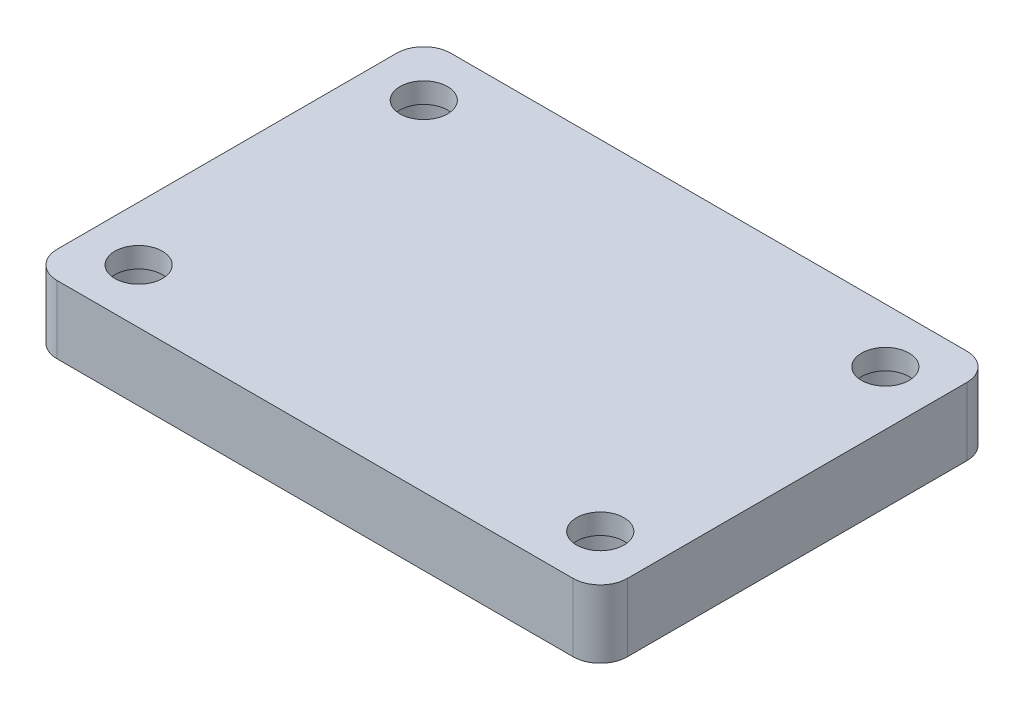
ISO-10303-21;
HEADER;
FILE_DESCRIPTION(('STEP AP214'),'2;1');
FILE_NAME('part.step','',(''),(''),'','','');
FILE_SCHEMA(('AUTOMOTIVE_DESIGN { 1 0 10303 214 1 1 1 1 }'));
ENDSEC;
DATA;
#1=APPLICATION_CONTEXT('core data for automotive mechanical design processes');
#2=APPLICATION_PROTOCOL_DEFINITION('international standard','automotive_design',2000,#1);
#3=PRODUCT_CONTEXT('',#1,'mechanical');
#4=PRODUCT('Part','Part','',(#3));
#5=PRODUCT_RELATED_PRODUCT_CATEGORY('part','',(#4));
#6=PRODUCT_DEFINITION_FORMATION('','',#4);
#7=PRODUCT_DEFINITION_CONTEXT('part definition',#1,'design');
#8=PRODUCT_DEFINITION('design','',#6,#7);
#9=PRODUCT_DEFINITION_SHAPE('','',#8);
#10=(LENGTH_UNIT() NAMED_UNIT(*) SI_UNIT(.MILLI.,.METRE.));
#11=(NAMED_UNIT(*) PLANE_ANGLE_UNIT() SI_UNIT($,.RADIAN.));
#12=(NAMED_UNIT(*) SI_UNIT($,.STERADIAN.) SOLID_ANGLE_UNIT());
#13=UNCERTAINTY_MEASURE_WITH_UNIT(LENGTH_MEASURE(1.E-05),#10,'distance_accuracy_value','');
#14=(GEOMETRIC_REPRESENTATION_CONTEXT(3) GLOBAL_UNCERTAINTY_ASSIGNED_CONTEXT((#13)) GLOBAL_UNIT_ASSIGNED_CONTEXT((#10,
#11,#12)) REPRESENTATION_CONTEXT('',''));
#15=CARTESIAN_POINT('',(0.,0.,0.));
#16=DIRECTION('',(0.,0.,1.));
#17=DIRECTION('',(1.,0.,0.));
#18=AXIS2_PLACEMENT_3D('',#15,#16,#17);
#19=CARTESIAN_POINT('',(0.,10.,0.));
#20=DIRECTION('',(1.,0.,0.));
#21=DIRECTION('',(0.,0.,-1.));
#22=AXIS2_PLACEMENT_3D('',#19,#20,#21);
#23=PLANE('',#22);
#24=DIRECTION('',(0.,0.,1.));
#25=VECTOR('',#24,1.);
#26=CARTESIAN_POINT('',(0.,0.,0.));
#27=LINE('',#26,#25);
#28=CARTESIAN_POINT('',(0.,0.,-54.));
#29=VERTEX_POINT('',#28);
#30=CARTESIAN_POINT('',(0.,0.,-4.));
#31=VERTEX_POINT('',#30);
#32=EDGE_CURVE('E130',#29,#31,#27,.T.);
#33=ORIENTED_EDGE('',*,*,#32,.T.);
#34=DIRECTION('',(0.,-1.,0.));
#35=VECTOR('',#34,1.);
#36=CARTESIAN_POINT('',(0.,10.,-4.));
#37=LINE('',#36,#35);
#38=CARTESIAN_POINT('',(0.,10.,-4.));
#39=VERTEX_POINT('',#38);
#40=EDGE_CURVE('E177',#31,#39,#37,.F.);
#41=ORIENTED_EDGE('',*,*,#40,.T.);
#42=DIRECTION('',(0.,0.,1.));
#43=VECTOR('',#42,1.);
#44=CARTESIAN_POINT('',(0.,10.,0.));
#45=LINE('',#44,#43);
#46=CARTESIAN_POINT('',(0.,10.,-54.));
#47=VERTEX_POINT('',#46);
#48=EDGE_CURVE('E128',#47,#39,#45,.T.);
#49=ORIENTED_EDGE('',*,*,#48,.F.);
#50=DIRECTION('',(0.,-1.,0.));
#51=VECTOR('',#50,1.);
#52=CARTESIAN_POINT('',(0.,10.,-54.));
#53=LINE('',#52,#51);
#54=EDGE_CURVE('E174',#47,#29,#53,.T.);
#55=ORIENTED_EDGE('',*,*,#54,.T.);
#56=EDGE_LOOP('',(#33,#41,#49,#55));
#57=FACE_BOUND('',#56,.T.);
#58=ADVANCED_FACE('F34',(#57),#23,.F.);
#59=CARTESIAN_POINT('',(0.,10.,0.));
#60=DIRECTION('',(0.,0.,-1.));
#61=DIRECTION('',(-1.,0.,0.));
#62=AXIS2_PLACEMENT_3D('',#59,#60,#61);
#63=PLANE('',#62);
#64=DIRECTION('',(1.,0.,0.));
#65=VECTOR('',#64,1.);
#66=CARTESIAN_POINT('',(0.,0.,0.));
#67=LINE('',#66,#65);
#68=CARTESIAN_POINT('',(4.,0.,0.));
#69=VERTEX_POINT('',#68);
#70=CARTESIAN_POINT('',(80.,0.,0.));
#71=VERTEX_POINT('',#70);
#72=EDGE_CURVE('E126',#69,#71,#67,.T.);
#73=ORIENTED_EDGE('',*,*,#72,.T.);
#74=DIRECTION('',(0.,-1.,0.));
#75=VECTOR('',#74,1.);
#76=CARTESIAN_POINT('',(80.,10.,0.));
#77=LINE('',#76,#75);
#78=CARTESIAN_POINT('',(80.,10.,0.));
#79=VERTEX_POINT('',#78);
#80=EDGE_CURVE('E104',#71,#79,#77,.F.);
#81=ORIENTED_EDGE('',*,*,#80,.T.);
#82=DIRECTION('',(1.,0.,0.));
#83=VECTOR('',#82,1.);
#84=CARTESIAN_POINT('',(0.,10.,0.));
#85=LINE('',#84,#83);
#86=CARTESIAN_POINT('',(4.,10.,0.));
#87=VERTEX_POINT('',#86);
#88=EDGE_CURVE('E193',#87,#79,#85,.T.);
#89=ORIENTED_EDGE('',*,*,#88,.F.);
#90=DIRECTION('',(0.,-1.,0.));
#91=VECTOR('',#90,1.);
#92=CARTESIAN_POINT('',(4.,10.,0.));
#93=LINE('',#92,#91);
#94=EDGE_CURVE('E109',#87,#69,#93,.T.);
#95=ORIENTED_EDGE('',*,*,#94,.T.);
#96=EDGE_LOOP('',(#73,#81,#89,#95));
#97=FACE_BOUND('',#96,.T.);
#98=ADVANCED_FACE('F255',(#97),#63,.F.);
#99=CARTESIAN_POINT('',(84.,10.,0.));
#100=DIRECTION('',(-1.,0.,0.));
#101=DIRECTION('',(0.,0.,1.));
#102=AXIS2_PLACEMENT_3D('',#99,#100,#101);
#103=PLANE('',#102);
#104=DIRECTION('',(0.,0.,-1.));
#105=VECTOR('',#104,1.);
#106=CARTESIAN_POINT('',(84.,10.,0.));
#107=LINE('',#106,#105);
#108=CARTESIAN_POINT('',(84.,10.,-4.));
#109=VERTEX_POINT('',#108);
#110=CARTESIAN_POINT('',(84.,10.,-54.));
#111=VERTEX_POINT('',#110);
#112=EDGE_CURVE('E118',#109,#111,#107,.T.);
#113=ORIENTED_EDGE('',*,*,#112,.F.);
#114=DIRECTION('',(0.,-1.,0.));
#115=VECTOR('',#114,1.);
#116=CARTESIAN_POINT('',(84.,10.,-4.));
#117=LINE('',#116,#115);
#118=CARTESIAN_POINT('',(84.,0.,-4.));
#119=VERTEX_POINT('',#118);
#120=EDGE_CURVE('E103',#109,#119,#117,.T.);
#121=ORIENTED_EDGE('',*,*,#120,.T.);
#122=DIRECTION('',(0.,0.,-1.));
#123=VECTOR('',#122,1.);
#124=CARTESIAN_POINT('',(84.,0.,0.));
#125=LINE('',#124,#123);
#126=CARTESIAN_POINT('',(84.,0.,-54.));
#127=VERTEX_POINT('',#126);
#128=EDGE_CURVE('E116',#119,#127,#125,.T.);
#129=ORIENTED_EDGE('',*,*,#128,.T.);
#130=DIRECTION('',(0.,-1.,0.));
#131=VECTOR('',#130,1.);
#132=CARTESIAN_POINT('',(84.,10.,-54.));
#133=LINE('',#132,#131);
#134=EDGE_CURVE('E120',#127,#111,#133,.F.);
#135=ORIENTED_EDGE('',*,*,#134,.T.);
#136=EDGE_LOOP('',(#113,#121,#129,#135));
#137=FACE_BOUND('',#136,.T.);
#138=ADVANCED_FACE('F115',(#137),#103,.F.);
#139=CARTESIAN_POINT('',(0.,10.,-58.));
#140=DIRECTION('',(0.,0.,1.));
#141=DIRECTION('',(1.,0.,0.));
#142=AXIS2_PLACEMENT_3D('',#139,#140,#141);
#143=PLANE('',#142);
#144=DIRECTION('',(-1.,0.,0.));
#145=VECTOR('',#144,1.);
#146=CARTESIAN_POINT('',(0.,0.,-58.));
#147=LINE('',#146,#145);
#148=CARTESIAN_POINT('',(80.,0.,-58.));
#149=VERTEX_POINT('',#148);
#150=CARTESIAN_POINT('',(4.,0.,-58.));
#151=VERTEX_POINT('',#150);
#152=EDGE_CURVE('E125',#149,#151,#147,.T.);
#153=ORIENTED_EDGE('',*,*,#152,.T.);
#154=DIRECTION('',(0.,-1.,0.));
#155=VECTOR('',#154,1.);
#156=CARTESIAN_POINT('',(4.,10.,-58.));
#157=LINE('',#156,#155);
#158=CARTESIAN_POINT('',(4.,10.,-58.));
#159=VERTEX_POINT('',#158);
#160=EDGE_CURVE('E11',#151,#159,#157,.F.);
#161=ORIENTED_EDGE('',*,*,#160,.T.);
#162=DIRECTION('',(-1.,0.,0.));
#163=VECTOR('',#162,1.);
#164=CARTESIAN_POINT('',(0.,10.,-58.));
#165=LINE('',#164,#163);
#166=CARTESIAN_POINT('',(80.,10.,-58.));
#167=VERTEX_POINT('',#166);
#168=EDGE_CURVE('E138',#167,#159,#165,.T.);
#169=ORIENTED_EDGE('',*,*,#168,.F.);
#170=DIRECTION('',(0.,-1.,0.));
#171=VECTOR('',#170,1.);
#172=CARTESIAN_POINT('',(80.,10.,-58.));
#173=LINE('',#172,#171);
#174=EDGE_CURVE('E42',#167,#149,#173,.T.);
#175=ORIENTED_EDGE('',*,*,#174,.T.);
#176=EDGE_LOOP('',(#153,#161,#169,#175));
#177=FACE_BOUND('',#176,.T.);
#178=ADVANCED_FACE('F180',(#177),#143,.F.);
#179=CARTESIAN_POINT('',(0.,10.,-58.));
#180=DIRECTION('',(0.,-1.,0.));
#181=DIRECTION('',(0.,0.,-1.));
#182=AXIS2_PLACEMENT_3D('',#179,#180,#181);
#183=PLANE('',#182);
#184=CARTESIAN_POINT('',(8.00000000000001,10.,-50.));
#185=DIRECTION('',(0.,-1.,0.));
#186=DIRECTION('',(0.,0.,-1.));
#187=AXIS2_PLACEMENT_3D('',#184,#185,#186);
#188=CIRCLE('',#187,3.5);
#189=CARTESIAN_POINT('',(8.00000000000001,10.,-53.5));
#190=VERTEX_POINT('',#189);
#191=EDGE_CURVE('E222',#190,#190,#188,.T.);
#192=ORIENTED_EDGE('',*,*,#191,.T.);
#193=EDGE_LOOP('',(#192));
#194=FACE_BOUND('',#193,.T.);
#195=CARTESIAN_POINT('',(76.,10.,-50.));
#196=DIRECTION('',(0.,-1.,0.));
#197=DIRECTION('',(0.,0.,-1.));
#198=AXIS2_PLACEMENT_3D('',#195,#196,#197);
#199=CIRCLE('',#198,3.5);
#200=CARTESIAN_POINT('',(76.,10.,-53.5));
#201=VERTEX_POINT('',#200);
#202=EDGE_CURVE('E198',#201,#201,#199,.T.);
#203=ORIENTED_EDGE('',*,*,#202,.T.);
#204=EDGE_LOOP('',(#203));
#205=FACE_BOUND('',#204,.T.);
#206=ORIENTED_EDGE('',*,*,#88,.T.);
#207=CARTESIAN_POINT('',(80.,10.,-4.));
#208=DIRECTION('',(0.,-1.,0.));
#209=DIRECTION('',(0.,0.,-1.));
#210=AXIS2_PLACEMENT_3D('',#207,#208,#209);
#211=CIRCLE('',#210,4.);
#212=EDGE_CURVE('E172',#79,#109,#211,.F.);
#213=ORIENTED_EDGE('',*,*,#212,.T.);
#214=ORIENTED_EDGE('',*,*,#112,.T.);
#215=CARTESIAN_POINT('',(80.,10.,-54.));
#216=DIRECTION('',(0.,-1.,0.));
#217=DIRECTION('',(0.,0.,-1.));
#218=AXIS2_PLACEMENT_3D('',#215,#216,#217);
#219=CIRCLE('',#218,4.);
#220=EDGE_CURVE('E54',#111,#167,#219,.F.);
#221=ORIENTED_EDGE('',*,*,#220,.T.);
#222=ORIENTED_EDGE('',*,*,#168,.T.);
#223=CARTESIAN_POINT('',(4.,10.,-54.));
#224=DIRECTION('',(0.,-1.,0.));
#225=DIRECTION('',(0.,0.,-1.));
#226=AXIS2_PLACEMENT_3D('',#223,#224,#225);
#227=CIRCLE('',#226,4.);
#228=EDGE_CURVE('E168',#159,#47,#227,.F.);
#229=ORIENTED_EDGE('',*,*,#228,.T.);
#230=ORIENTED_EDGE('',*,*,#48,.T.);
#231=CARTESIAN_POINT('',(4.,10.,-4.));
#232=DIRECTION('',(0.,-1.,0.));
#233=DIRECTION('',(0.,0.,-1.));
#234=AXIS2_PLACEMENT_3D('',#231,#232,#233);
#235=CIRCLE('',#234,4.);
#236=EDGE_CURVE('E170',#39,#87,#235,.F.);
#237=ORIENTED_EDGE('',*,*,#236,.T.);
#238=EDGE_LOOP('',(#206,#213,#214,#221,#222,#229,#230,#237));
#239=FACE_BOUND('',#238,.T.);
#240=CARTESIAN_POINT('',(76.,10.,-8.));
#241=DIRECTION('',(0.,-1.,0.));
#242=DIRECTION('',(0.,0.,-1.));
#243=AXIS2_PLACEMENT_3D('',#240,#241,#242);
#244=CIRCLE('',#243,3.5);
#245=CARTESIAN_POINT('',(76.,10.,-11.5));
#246=VERTEX_POINT('',#245);
#247=EDGE_CURVE('E137',#246,#246,#244,.T.);
#248=ORIENTED_EDGE('',*,*,#247,.T.);
#249=EDGE_LOOP('',(#248));
#250=FACE_BOUND('',#249,.T.);
#251=CARTESIAN_POINT('',(8.00000000000001,10.,-8.));
#252=DIRECTION('',(0.,-1.,0.));
#253=DIRECTION('',(0.,0.,-1.));
#254=AXIS2_PLACEMENT_3D('',#251,#252,#253);
#255=CIRCLE('',#254,3.5);
#256=CARTESIAN_POINT('',(8.00000000000001,10.,-11.5));
#257=VERTEX_POINT('',#256);
#258=EDGE_CURVE('E150',#257,#257,#255,.T.);
#259=ORIENTED_EDGE('',*,*,#258,.T.);
#260=EDGE_LOOP('',(#259));
#261=FACE_BOUND('',#260,.T.);
#262=ADVANCED_FACE('F234',(#194,#205,#239,#250,#261),#183,.F.);
#263=CARTESIAN_POINT('',(0.,0.,-58.));
#264=DIRECTION('',(0.,-1.,0.));
#265=DIRECTION('',(0.,0.,-1.));
#266=AXIS2_PLACEMENT_3D('',#263,#264,#265);
#267=PLANE('',#266);
#268=CARTESIAN_POINT('',(8.00000000000001,0.,-50.));
#269=DIRECTION('',(0.,-1.,0.));
#270=DIRECTION('',(0.,0.,-1.));
#271=AXIS2_PLACEMENT_3D('',#268,#269,#270);
#272=CIRCLE('',#271,5.50000000000001);
#273=CARTESIAN_POINT('',(8.00000000000001,0.,-55.5));
#274=VERTEX_POINT('',#273);
#275=EDGE_CURVE('E225',#274,#274,#272,.T.);
#276=ORIENTED_EDGE('',*,*,#275,.F.);
#277=EDGE_LOOP('',(#276));
#278=FACE_BOUND('',#277,.T.);
#279=CARTESIAN_POINT('',(76.,0.,-50.));
#280=DIRECTION('',(0.,-1.,0.));
#281=DIRECTION('',(0.,0.,-1.));
#282=AXIS2_PLACEMENT_3D('',#279,#280,#281);
#283=CIRCLE('',#282,5.50000000000001);
#284=CARTESIAN_POINT('',(76.,0.,-55.5));
#285=VERTEX_POINT('',#284);
#286=EDGE_CURVE('E211',#285,#285,#283,.T.);
#287=ORIENTED_EDGE('',*,*,#286,.F.);
#288=EDGE_LOOP('',(#287));
#289=FACE_BOUND('',#288,.T.);
#290=ORIENTED_EDGE('',*,*,#128,.F.);
#291=CARTESIAN_POINT('',(80.,0.,-4.));
#292=DIRECTION('',(0.,-1.,0.));
#293=DIRECTION('',(0.,0.,-1.));
#294=AXIS2_PLACEMENT_3D('',#291,#292,#293);
#295=CIRCLE('',#294,4.);
#296=EDGE_CURVE('E99',#119,#71,#295,.T.);
#297=ORIENTED_EDGE('',*,*,#296,.T.);
#298=ORIENTED_EDGE('',*,*,#72,.F.);
#299=CARTESIAN_POINT('',(4.,0.,-4.));
#300=DIRECTION('',(0.,-1.,0.));
#301=DIRECTION('',(0.,0.,-1.));
#302=AXIS2_PLACEMENT_3D('',#299,#300,#301);
#303=CIRCLE('',#302,4.);
#304=EDGE_CURVE('E110',#69,#31,#303,.T.);
#305=ORIENTED_EDGE('',*,*,#304,.T.);
#306=ORIENTED_EDGE('',*,*,#32,.F.);
#307=CARTESIAN_POINT('',(4.,0.,-54.));
#308=DIRECTION('',(0.,-1.,0.));
#309=DIRECTION('',(0.,0.,-1.));
#310=AXIS2_PLACEMENT_3D('',#307,#308,#309);
#311=CIRCLE('',#310,4.);
#312=EDGE_CURVE('E161',#29,#151,#311,.T.);
#313=ORIENTED_EDGE('',*,*,#312,.T.);
#314=ORIENTED_EDGE('',*,*,#152,.F.);
#315=CARTESIAN_POINT('',(80.,0.,-54.));
#316=DIRECTION('',(0.,-1.,0.));
#317=DIRECTION('',(0.,0.,-1.));
#318=AXIS2_PLACEMENT_3D('',#315,#316,#317);
#319=CIRCLE('',#318,4.);
#320=EDGE_CURVE('E119',#149,#127,#319,.T.);
#321=ORIENTED_EDGE('',*,*,#320,.T.);
#322=EDGE_LOOP('',(#290,#297,#298,#305,#306,#313,#314,#321));
#323=FACE_BOUND('',#322,.T.);
#324=CARTESIAN_POINT('',(76.,0.,-8.));
#325=DIRECTION('',(0.,-1.,0.));
#326=DIRECTION('',(0.,0.,-1.));
#327=AXIS2_PLACEMENT_3D('',#324,#325,#326);
#328=CIRCLE('',#327,5.50000000000001);
#329=CARTESIAN_POINT('',(76.,0.,-13.5));
#330=VERTEX_POINT('',#329);
#331=EDGE_CURVE('E134',#330,#330,#328,.T.);
#332=ORIENTED_EDGE('',*,*,#331,.F.);
#333=EDGE_LOOP('',(#332));
#334=FACE_BOUND('',#333,.T.);
#335=CARTESIAN_POINT('',(8.00000000000001,0.,-8.));
#336=DIRECTION('',(0.,-1.,0.));
#337=DIRECTION('',(0.,0.,-1.));
#338=AXIS2_PLACEMENT_3D('',#335,#336,#337);
#339=CIRCLE('',#338,5.50000000000001);
#340=CARTESIAN_POINT('',(8.00000000000001,0.,-13.5));
#341=VERTEX_POINT('',#340);
#342=EDGE_CURVE('E147',#341,#341,#339,.T.);
#343=ORIENTED_EDGE('',*,*,#342,.F.);
#344=EDGE_LOOP('',(#343));
#345=FACE_BOUND('',#344,.T.);
#346=ADVANCED_FACE('F122',(#278,#289,#323,#334,#345),#267,.T.);
#347=CARTESIAN_POINT('',(76.,0.,-50.));
#348=DIRECTION('',(0.,-1.,0.));
#349=DIRECTION('',(0.,0.,-1.));
#350=AXIS2_PLACEMENT_3D('',#347,#348,#349);
#351=CYLINDRICAL_SURFACE('',#350,3.5);
#352=ORIENTED_EDGE('',*,*,#202,.F.);
#353=EDGE_LOOP('',(#352));
#354=FACE_BOUND('',#353,.T.);
#355=CARTESIAN_POINT('',(76.,7.,-50.));
#356=DIRECTION('',(0.,-1.,0.));
#357=DIRECTION('',(0.,0.,-1.));
#358=AXIS2_PLACEMENT_3D('',#355,#356,#357);
#359=CIRCLE('',#358,3.5);
#360=CARTESIAN_POINT('',(76.,7.,-53.5));
#361=VERTEX_POINT('',#360);
#362=EDGE_CURVE('E203',#361,#361,#359,.T.);
#363=ORIENTED_EDGE('',*,*,#362,.T.);
#364=EDGE_LOOP('',(#363));
#365=FACE_BOUND('',#364,.T.);
#366=ADVANCED_FACE('F233',(#354,#365),#351,.F.);
#367=CARTESIAN_POINT('',(79.5,7.,-50.));
#368=DIRECTION('',(0.,1.,0.));
#369=DIRECTION('',(0.,0.,1.));
#370=AXIS2_PLACEMENT_3D('',#367,#368,#369);
#371=PLANE('',#370);
#372=ORIENTED_EDGE('',*,*,#362,.F.);
#373=EDGE_LOOP('',(#372));
#374=FACE_BOUND('',#373,.T.);
#375=CARTESIAN_POINT('',(76.,7.,-50.));
#376=DIRECTION('',(0.,-1.,0.));
#377=DIRECTION('',(0.,0.,-1.));
#378=AXIS2_PLACEMENT_3D('',#375,#376,#377);
#379=CIRCLE('',#378,5.50000000000001);
#380=CARTESIAN_POINT('',(76.,7.,-55.5));
#381=VERTEX_POINT('',#380);
#382=EDGE_CURVE('E207',#381,#381,#379,.T.);
#383=ORIENTED_EDGE('',*,*,#382,.T.);
#384=EDGE_LOOP('',(#383));
#385=FACE_BOUND('',#384,.T.);
#386=ADVANCED_FACE('F241',(#374,#385),#371,.F.);
#387=CARTESIAN_POINT('',(76.,0.,-50.));
#388=DIRECTION('',(0.,-1.,0.));
#389=DIRECTION('',(0.,0.,-1.));
#390=AXIS2_PLACEMENT_3D('',#387,#388,#389);
#391=CYLINDRICAL_SURFACE('',#390,5.50000000000001);
#392=ORIENTED_EDGE('',*,*,#382,.F.);
#393=EDGE_LOOP('',(#392));
#394=FACE_BOUND('',#393,.T.);
#395=ORIENTED_EDGE('',*,*,#286,.T.);
#396=EDGE_LOOP('',(#395));
#397=FACE_BOUND('',#396,.T.);
#398=ADVANCED_FACE('F238',(#394,#397),#391,.F.);
#399=CARTESIAN_POINT('',(8.00000000000001,0.,-50.));
#400=DIRECTION('',(0.,-1.,0.));
#401=DIRECTION('',(0.,0.,-1.));
#402=AXIS2_PLACEMENT_3D('',#399,#400,#401);
#403=CYLINDRICAL_SURFACE('',#402,3.5);
#404=ORIENTED_EDGE('',*,*,#191,.F.);
#405=EDGE_LOOP('',(#404));
#406=FACE_BOUND('',#405,.T.);
#407=CARTESIAN_POINT('',(8.00000000000001,7.,-50.));
#408=DIRECTION('',(0.,-1.,0.));
#409=DIRECTION('',(0.,0.,-1.));
#410=AXIS2_PLACEMENT_3D('',#407,#408,#409);
#411=CIRCLE('',#410,3.5);
#412=CARTESIAN_POINT('',(8.00000000000001,7.,-53.5));
#413=VERTEX_POINT('',#412);
#414=EDGE_CURVE('E216',#413,#413,#411,.T.);
#415=ORIENTED_EDGE('',*,*,#414,.T.);
#416=EDGE_LOOP('',(#415));
#417=FACE_BOUND('',#416,.T.);
#418=ADVANCED_FACE('F240',(#406,#417),#403,.F.);
#419=CARTESIAN_POINT('',(11.5,7.,-50.));
#420=DIRECTION('',(0.,1.,0.));
#421=DIRECTION('',(0.,0.,1.));
#422=AXIS2_PLACEMENT_3D('',#419,#420,#421);
#423=PLANE('',#422);
#424=ORIENTED_EDGE('',*,*,#414,.F.);
#425=EDGE_LOOP('',(#424));
#426=FACE_BOUND('',#425,.T.);
#427=CARTESIAN_POINT('',(8.00000000000001,7.,-50.));
#428=DIRECTION('',(0.,-1.,0.));
#429=DIRECTION('',(0.,0.,-1.));
#430=AXIS2_PLACEMENT_3D('',#427,#428,#429);
#431=CIRCLE('',#430,5.50000000000001);
#432=CARTESIAN_POINT('',(8.00000000000001,7.,-55.5));
#433=VERTEX_POINT('',#432);
#434=EDGE_CURVE('E219',#433,#433,#431,.T.);
#435=ORIENTED_EDGE('',*,*,#434,.T.);
#436=EDGE_LOOP('',(#435));
#437=FACE_BOUND('',#436,.T.);
#438=ADVANCED_FACE('F248',(#426,#437),#423,.F.);
#439=CARTESIAN_POINT('',(8.00000000000001,0.,-50.));
#440=DIRECTION('',(0.,-1.,0.));
#441=DIRECTION('',(0.,0.,-1.));
#442=AXIS2_PLACEMENT_3D('',#439,#440,#441);
#443=CYLINDRICAL_SURFACE('',#442,5.50000000000001);
#444=ORIENTED_EDGE('',*,*,#434,.F.);
#445=EDGE_LOOP('',(#444));
#446=FACE_BOUND('',#445,.T.);
#447=ORIENTED_EDGE('',*,*,#275,.T.);
#448=EDGE_LOOP('',(#447));
#449=FACE_BOUND('',#448,.T.);
#450=ADVANCED_FACE('F229',(#446,#449),#443,.F.);
#451=CARTESIAN_POINT('',(76.,0.,-8.));
#452=DIRECTION('',(0.,-1.,0.));
#453=DIRECTION('',(0.,0.,-1.));
#454=AXIS2_PLACEMENT_3D('',#451,#452,#453);
#455=CYLINDRICAL_SURFACE('',#454,5.50000000000001);
#456=CARTESIAN_POINT('',(76.,7.,-8.));
#457=DIRECTION('',(0.,-1.,0.));
#458=DIRECTION('',(0.,0.,-1.));
#459=AXIS2_PLACEMENT_3D('',#456,#457,#458);
#460=CIRCLE('',#459,5.50000000000001);
#461=CARTESIAN_POINT('',(76.,7.,-13.5));
#462=VERTEX_POINT('',#461);
#463=EDGE_CURVE('E144',#462,#462,#460,.T.);
#464=ORIENTED_EDGE('',*,*,#463,.F.);
#465=EDGE_LOOP('',(#464));
#466=FACE_BOUND('',#465,.T.);
#467=ORIENTED_EDGE('',*,*,#331,.T.);
#468=EDGE_LOOP('',(#467));
#469=FACE_BOUND('',#468,.T.);
#470=ADVANCED_FACE('F272',(#466,#469),#455,.F.);
#471=CARTESIAN_POINT('',(79.5,7.,-8.));
#472=DIRECTION('',(0.,1.,0.));
#473=DIRECTION('',(0.,0.,1.));
#474=AXIS2_PLACEMENT_3D('',#471,#472,#473);
#475=PLANE('',#474);
#476=CARTESIAN_POINT('',(76.,7.,-8.));
#477=DIRECTION('',(0.,-1.,0.));
#478=DIRECTION('',(0.,0.,-1.));
#479=AXIS2_PLACEMENT_3D('',#476,#477,#478);
#480=CIRCLE('',#479,3.5);
#481=CARTESIAN_POINT('',(76.,7.,-11.5));
#482=VERTEX_POINT('',#481);
#483=EDGE_CURVE('E141',#482,#482,#480,.T.);
#484=ORIENTED_EDGE('',*,*,#483,.F.);
#485=EDGE_LOOP('',(#484));
#486=FACE_BOUND('',#485,.T.);
#487=ORIENTED_EDGE('',*,*,#463,.T.);
#488=EDGE_LOOP('',(#487));
#489=FACE_BOUND('',#488,.T.);
#490=ADVANCED_FACE('F268',(#486,#489),#475,.F.);
#491=CARTESIAN_POINT('',(76.,0.,-8.));
#492=DIRECTION('',(0.,-1.,0.));
#493=DIRECTION('',(0.,0.,-1.));
#494=AXIS2_PLACEMENT_3D('',#491,#492,#493);
#495=CYLINDRICAL_SURFACE('',#494,3.5);
#496=ORIENTED_EDGE('',*,*,#247,.F.);
#497=EDGE_LOOP('',(#496));
#498=FACE_BOUND('',#497,.T.);
#499=ORIENTED_EDGE('',*,*,#483,.T.);
#500=EDGE_LOOP('',(#499));
#501=FACE_BOUND('',#500,.T.);
#502=ADVANCED_FACE('F264',(#498,#501),#495,.F.);
#503=CARTESIAN_POINT('',(8.00000000000001,0.,-8.));
#504=DIRECTION('',(0.,-1.,0.));
#505=DIRECTION('',(0.,0.,-1.));
#506=AXIS2_PLACEMENT_3D('',#503,#504,#505);
#507=CYLINDRICAL_SURFACE('',#506,5.50000000000001);
#508=CARTESIAN_POINT('',(8.00000000000001,7.,-8.));
#509=DIRECTION('',(0.,-1.,0.));
#510=DIRECTION('',(0.,0.,-1.));
#511=AXIS2_PLACEMENT_3D('',#508,#509,#510);
#512=CIRCLE('',#511,5.50000000000001);
#513=CARTESIAN_POINT('',(8.00000000000001,7.,-13.5));
#514=VERTEX_POINT('',#513);
#515=EDGE_CURVE('E156',#514,#514,#512,.T.);
#516=ORIENTED_EDGE('',*,*,#515,.F.);
#517=EDGE_LOOP('',(#516));
#518=FACE_BOUND('',#517,.T.);
#519=ORIENTED_EDGE('',*,*,#342,.T.);
#520=EDGE_LOOP('',(#519));
#521=FACE_BOUND('',#520,.T.);
#522=ADVANCED_FACE('F267',(#518,#521),#507,.F.);
#523=CARTESIAN_POINT('',(11.5,7.,-8.));
#524=DIRECTION('',(0.,1.,0.));
#525=DIRECTION('',(0.,0.,1.));
#526=AXIS2_PLACEMENT_3D('',#523,#524,#525);
#527=PLANE('',#526);
#528=CARTESIAN_POINT('',(8.00000000000001,7.,-8.));
#529=DIRECTION('',(0.,-1.,0.));
#530=DIRECTION('',(0.,0.,-1.));
#531=AXIS2_PLACEMENT_3D('',#528,#529,#530);
#532=CIRCLE('',#531,3.5);
#533=CARTESIAN_POINT('',(8.00000000000001,7.,-11.5));
#534=VERTEX_POINT('',#533);
#535=EDGE_CURVE('E153',#534,#534,#532,.T.);
#536=ORIENTED_EDGE('',*,*,#535,.F.);
#537=EDGE_LOOP('',(#536));
#538=FACE_BOUND('',#537,.T.);
#539=ORIENTED_EDGE('',*,*,#515,.T.);
#540=EDGE_LOOP('',(#539));
#541=FACE_BOUND('',#540,.T.);
#542=ADVANCED_FACE('F280',(#538,#541),#527,.F.);
#543=CARTESIAN_POINT('',(8.00000000000001,0.,-8.));
#544=DIRECTION('',(0.,-1.,0.));
#545=DIRECTION('',(0.,0.,-1.));
#546=AXIS2_PLACEMENT_3D('',#543,#544,#545);
#547=CYLINDRICAL_SURFACE('',#546,3.5);
#548=ORIENTED_EDGE('',*,*,#258,.F.);
#549=EDGE_LOOP('',(#548));
#550=FACE_BOUND('',#549,.T.);
#551=ORIENTED_EDGE('',*,*,#535,.T.);
#552=EDGE_LOOP('',(#551));
#553=FACE_BOUND('',#552,.T.);
#554=ADVANCED_FACE('F277',(#550,#553),#547,.F.);
#555=CARTESIAN_POINT('',(80.,10.,-4.));
#556=DIRECTION('',(0.,-1.,0.));
#557=DIRECTION('',(0.,0.,-1.));
#558=AXIS2_PLACEMENT_3D('',#555,#556,#557);
#559=CYLINDRICAL_SURFACE('',#558,4.);
#560=ORIENTED_EDGE('',*,*,#212,.F.);
#561=ORIENTED_EDGE('',*,*,#80,.F.);
#562=ORIENTED_EDGE('',*,*,#296,.F.);
#563=ORIENTED_EDGE('',*,*,#120,.F.);
#564=EDGE_LOOP('',(#560,#561,#562,#563));
#565=FACE_BOUND('',#564,.T.);
#566=ADVANCED_FACE('F102',(#565),#559,.T.);
#567=CARTESIAN_POINT('',(4.,10.,-4.));
#568=DIRECTION('',(0.,-1.,0.));
#569=DIRECTION('',(0.,0.,-1.));
#570=AXIS2_PLACEMENT_3D('',#567,#568,#569);
#571=CYLINDRICAL_SURFACE('',#570,4.);
#572=ORIENTED_EDGE('',*,*,#236,.F.);
#573=ORIENTED_EDGE('',*,*,#40,.F.);
#574=ORIENTED_EDGE('',*,*,#304,.F.);
#575=ORIENTED_EDGE('',*,*,#94,.F.);
#576=EDGE_LOOP('',(#572,#573,#574,#575));
#577=FACE_BOUND('',#576,.T.);
#578=ADVANCED_FACE('F290',(#577),#571,.T.);
#579=CARTESIAN_POINT('',(4.,10.,-54.));
#580=DIRECTION('',(0.,-1.,0.));
#581=DIRECTION('',(0.,0.,-1.));
#582=AXIS2_PLACEMENT_3D('',#579,#580,#581);
#583=CYLINDRICAL_SURFACE('',#582,4.);
#584=ORIENTED_EDGE('',*,*,#228,.F.);
#585=ORIENTED_EDGE('',*,*,#160,.F.);
#586=ORIENTED_EDGE('',*,*,#312,.F.);
#587=ORIENTED_EDGE('',*,*,#54,.F.);
#588=EDGE_LOOP('',(#584,#585,#586,#587));
#589=FACE_BOUND('',#588,.T.);
#590=ADVANCED_FACE('F187',(#589),#583,.T.);
#591=CARTESIAN_POINT('',(80.,10.,-54.));
#592=DIRECTION('',(0.,-1.,0.));
#593=DIRECTION('',(0.,0.,-1.));
#594=AXIS2_PLACEMENT_3D('',#591,#592,#593);
#595=CYLINDRICAL_SURFACE('',#594,4.);
#596=ORIENTED_EDGE('',*,*,#220,.F.);
#597=ORIENTED_EDGE('',*,*,#134,.F.);
#598=ORIENTED_EDGE('',*,*,#320,.F.);
#599=ORIENTED_EDGE('',*,*,#174,.F.);
#600=EDGE_LOOP('',(#596,#597,#598,#599));
#601=FACE_BOUND('',#600,.T.);
#602=ADVANCED_FACE('F36',(#601),#595,.T.);
#603=CLOSED_SHELL('',(#58,#98,#138,#178,#262,#346,#366,#386,#398,#418,#438,#450,#470,#490,#502,
#522,#542,#554,#566,#578,#590,#602));
#604=MANIFOLD_SOLID_BREP('B2',#603);
#605=ADVANCED_BREP_SHAPE_REPRESENTATION('',(#18,#604),#14);
#606=SHAPE_DEFINITION_REPRESENTATION(#9,#605);
ENDSEC;
END-ISO-10303-21;
